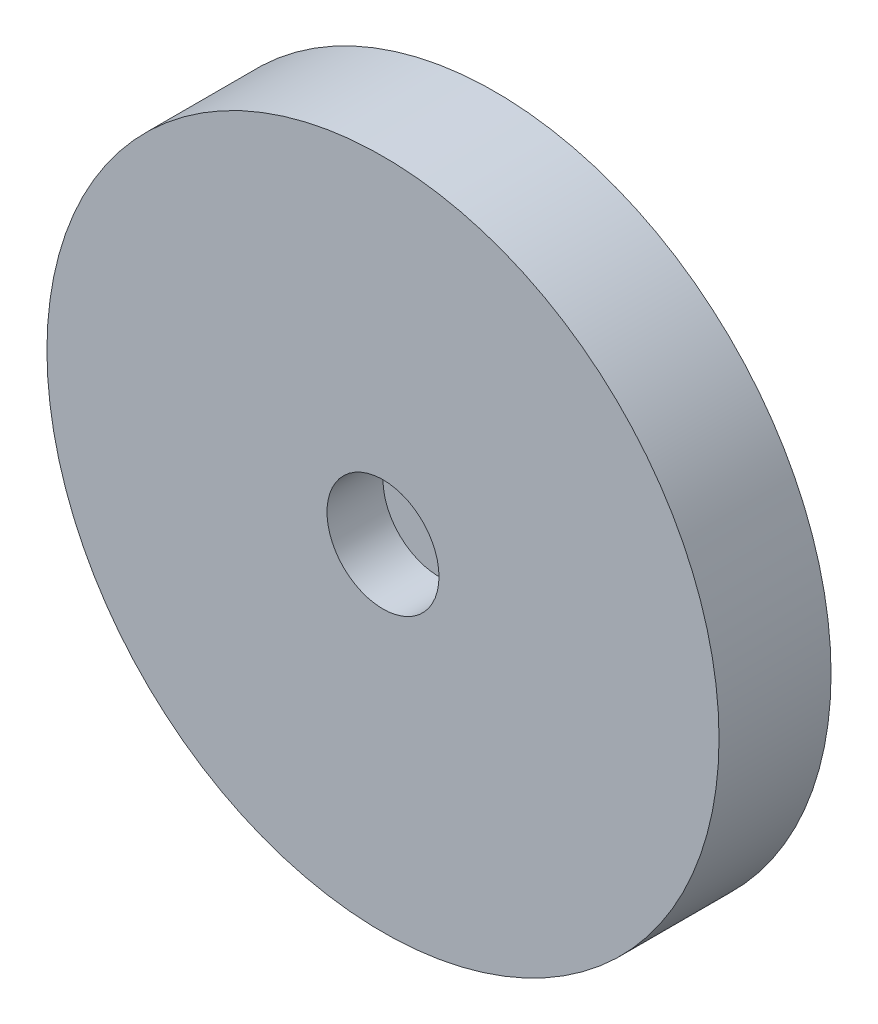
ISO-10303-21;
HEADER;
FILE_DESCRIPTION(('STEP AP214'),'2;1');
FILE_NAME('part.step','',(''),(''),'','','');
FILE_SCHEMA(('AUTOMOTIVE_DESIGN { 1 0 10303 214 1 1 1 1 }'));
ENDSEC;
DATA;
#1=APPLICATION_CONTEXT('core data for automotive mechanical design processes');
#2=APPLICATION_PROTOCOL_DEFINITION('international standard','automotive_design',2000,#1);
#3=PRODUCT_CONTEXT('',#1,'mechanical');
#4=PRODUCT('Part','Part','',(#3));
#5=PRODUCT_RELATED_PRODUCT_CATEGORY('part','',(#4));
#6=PRODUCT_DEFINITION_FORMATION('','',#4);
#7=PRODUCT_DEFINITION_CONTEXT('part definition',#1,'design');
#8=PRODUCT_DEFINITION('design','',#6,#7);
#9=PRODUCT_DEFINITION_SHAPE('','',#8);
#10=(LENGTH_UNIT() NAMED_UNIT(*) SI_UNIT(.MILLI.,.METRE.));
#11=(NAMED_UNIT(*) PLANE_ANGLE_UNIT() SI_UNIT($,.RADIAN.));
#12=(NAMED_UNIT(*) SI_UNIT($,.STERADIAN.) SOLID_ANGLE_UNIT());
#13=UNCERTAINTY_MEASURE_WITH_UNIT(LENGTH_MEASURE(1.E-05),#10,'distance_accuracy_value','');
#14=(GEOMETRIC_REPRESENTATION_CONTEXT(3) GLOBAL_UNCERTAINTY_ASSIGNED_CONTEXT((#13)) GLOBAL_UNIT_ASSIGNED_CONTEXT((#10,
#11,#12)) REPRESENTATION_CONTEXT('',''));
#15=CARTESIAN_POINT('',(0.,0.,0.));
#16=DIRECTION('',(0.,0.,1.));
#17=DIRECTION('',(1.,0.,0.));
#18=AXIS2_PLACEMENT_3D('',#15,#16,#17);
#19=CARTESIAN_POINT('',(0.,0.,50.));
#20=DIRECTION('',(0.,0.,-1.));
#21=DIRECTION('',(-1.,0.,0.));
#22=AXIS2_PLACEMENT_3D('',#19,#20,#21);
#23=CYLINDRICAL_SURFACE('',#22,150.);
#24=CARTESIAN_POINT('',(0.,0.,50.));
#25=DIRECTION('',(0.,0.,1.));
#26=DIRECTION('',(1.,0.,0.));
#27=AXIS2_PLACEMENT_3D('',#24,#25,#26);
#28=CIRCLE('',#27,150.);
#29=CARTESIAN_POINT('',(150.,0.,50.));
#30=VERTEX_POINT('',#29);
#31=EDGE_CURVE('E10',#30,#30,#28,.T.);
#32=ORIENTED_EDGE('',*,*,#31,.F.);
#33=EDGE_LOOP('',(#32));
#34=FACE_BOUND('',#33,.T.);
#35=CARTESIAN_POINT('',(0.,0.,0.));
#36=DIRECTION('',(0.,0.,1.));
#37=DIRECTION('',(1.,0.,0.));
#38=AXIS2_PLACEMENT_3D('',#35,#36,#37);
#39=CIRCLE('',#38,150.);
#40=CARTESIAN_POINT('',(150.,0.,0.));
#41=VERTEX_POINT('',#40);
#42=EDGE_CURVE('E48',#41,#41,#39,.T.);
#43=ORIENTED_EDGE('',*,*,#42,.T.);
#44=EDGE_LOOP('',(#43));
#45=FACE_BOUND('',#44,.T.);
#46=ADVANCED_FACE('F45',(#34,#45),#23,.T.);
#47=CARTESIAN_POINT('',(0.,0.,50.));
#48=DIRECTION('',(0.,0.,1.));
#49=DIRECTION('',(1.,0.,0.));
#50=AXIS2_PLACEMENT_3D('',#47,#48,#49);
#51=PLANE('',#50);
#52=CARTESIAN_POINT('',(0.,0.,50.));
#53=DIRECTION('',(0.,0.,1.));
#54=DIRECTION('',(1.,0.,0.));
#55=AXIS2_PLACEMENT_3D('',#52,#53,#54);
#56=CIRCLE('',#55,25.);
#57=CARTESIAN_POINT('',(25.,0.,50.));
#58=VERTEX_POINT('',#57);
#59=EDGE_CURVE('E59',#58,#58,#56,.T.);
#60=ORIENTED_EDGE('',*,*,#59,.F.);
#61=EDGE_LOOP('',(#60));
#62=FACE_BOUND('',#61,.T.);
#63=ORIENTED_EDGE('',*,*,#31,.T.);
#64=EDGE_LOOP('',(#63));
#65=FACE_BOUND('',#64,.T.);
#66=ADVANCED_FACE('F76',(#62,#65),#51,.T.);
#67=CARTESIAN_POINT('',(0.,0.,0.));
#68=DIRECTION('',(0.,0.,1.));
#69=DIRECTION('',(1.,0.,0.));
#70=AXIS2_PLACEMENT_3D('',#67,#68,#69);
#71=PLANE('',#70);
#72=ORIENTED_EDGE('',*,*,#42,.F.);
#73=EDGE_LOOP('',(#72));
#74=FACE_BOUND('',#73,.T.);
#75=ADVANCED_FACE('F72',(#74),#71,.F.);
#76=CARTESIAN_POINT('',(0.,0.,25.));
#77=DIRECTION('',(0.,0.,1.));
#78=DIRECTION('',(1.,0.,0.));
#79=AXIS2_PLACEMENT_3D('',#76,#77,#78);
#80=CYLINDRICAL_SURFACE('',#79,25.);
#81=CARTESIAN_POINT('',(0.,0.,25.));
#82=DIRECTION('',(0.,0.,1.));
#83=DIRECTION('',(1.,0.,0.));
#84=AXIS2_PLACEMENT_3D('',#81,#82,#83);
#85=CIRCLE('',#84,25.);
#86=CARTESIAN_POINT('',(25.,0.,25.));
#87=VERTEX_POINT('',#86);
#88=EDGE_CURVE('E57',#87,#87,#85,.T.);
#89=ORIENTED_EDGE('',*,*,#88,.F.);
#90=EDGE_LOOP('',(#89));
#91=FACE_BOUND('',#90,.T.);
#92=ORIENTED_EDGE('',*,*,#59,.T.);
#93=EDGE_LOOP('',(#92));
#94=FACE_BOUND('',#93,.T.);
#95=ADVANCED_FACE('F69',(#91,#94),#80,.F.);
#96=CARTESIAN_POINT('',(0.,0.,25.));
#97=DIRECTION('',(0.,0.,1.));
#98=DIRECTION('',(1.,0.,0.));
#99=AXIS2_PLACEMENT_3D('',#96,#97,#98);
#100=PLANE('',#99);
#101=ORIENTED_EDGE('',*,*,#88,.T.);
#102=EDGE_LOOP('',(#101));
#103=FACE_BOUND('',#102,.T.);
#104=ADVANCED_FACE('F67',(#103),#100,.T.);
#105=CLOSED_SHELL('',(#46,#66,#75,#95,#104));
#106=MANIFOLD_SOLID_BREP('B2',#105);
#107=ADVANCED_BREP_SHAPE_REPRESENTATION('',(#18,#106),#14);
#108=SHAPE_DEFINITION_REPRESENTATION(#9,#107);
ENDSEC;
END-ISO-10303-21;
